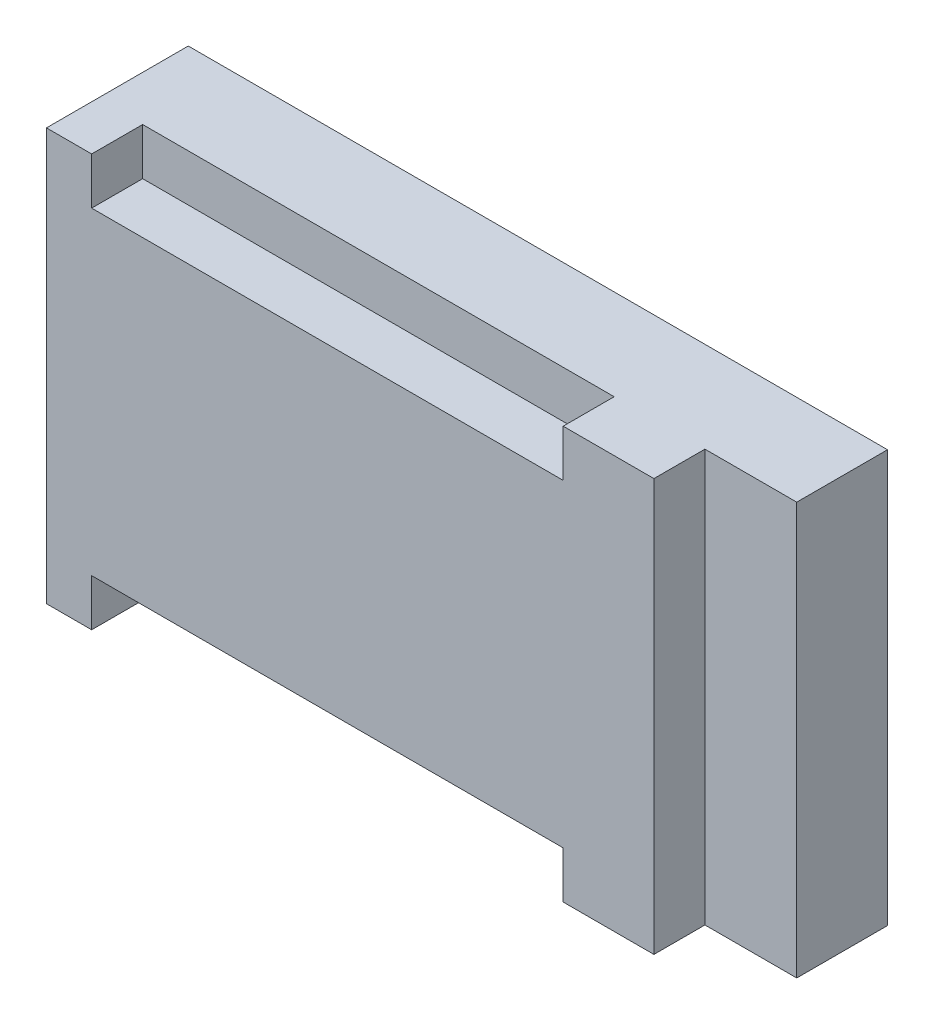
ISO-10303-21;
HEADER;
FILE_DESCRIPTION(('STEP AP214'),'2;1');
FILE_NAME('part.step','',(''),(''),'','','');
FILE_SCHEMA(('AUTOMOTIVE_DESIGN { 1 0 10303 214 1 1 1 1 }'));
ENDSEC;
DATA;
#1=APPLICATION_CONTEXT('core data for automotive mechanical design processes');
#2=APPLICATION_PROTOCOL_DEFINITION('international standard','automotive_design',2000,#1);
#3=PRODUCT_CONTEXT('',#1,'mechanical');
#4=PRODUCT('Part','Part','',(#3));
#5=PRODUCT_RELATED_PRODUCT_CATEGORY('part','',(#4));
#6=PRODUCT_DEFINITION_FORMATION('','',#4);
#7=PRODUCT_DEFINITION_CONTEXT('part definition',#1,'design');
#8=PRODUCT_DEFINITION('design','',#6,#7);
#9=PRODUCT_DEFINITION_SHAPE('','',#8);
#10=(LENGTH_UNIT() NAMED_UNIT(*) SI_UNIT(.MILLI.,.METRE.));
#11=(NAMED_UNIT(*) PLANE_ANGLE_UNIT() SI_UNIT($,.RADIAN.));
#12=(NAMED_UNIT(*) SI_UNIT($,.STERADIAN.) SOLID_ANGLE_UNIT());
#13=UNCERTAINTY_MEASURE_WITH_UNIT(LENGTH_MEASURE(1.E-05),#10,'distance_accuracy_value','');
#14=(GEOMETRIC_REPRESENTATION_CONTEXT(3) GLOBAL_UNCERTAINTY_ASSIGNED_CONTEXT((#13)) GLOBAL_UNIT_ASSIGNED_CONTEXT((#10,
#11,#12)) REPRESENTATION_CONTEXT('',''));
#15=CARTESIAN_POINT('',(0.,0.,0.));
#16=DIRECTION('',(0.,0.,1.));
#17=DIRECTION('',(1.,0.,0.));
#18=AXIS2_PLACEMENT_3D('',#15,#16,#17);
#19=CARTESIAN_POINT('',(-76.0303000874041,33.4271146936001,27.8));
#20=DIRECTION('',(1.,0.,0.));
#21=DIRECTION('',(0.,1.,0.));
#22=AXIS2_PLACEMENT_3D('',#19,#20,#21);
#23=PLANE('',#22);
#24=DIRECTION('',(0.,-1.,0.));
#25=VECTOR('',#24,1.);
#26=CARTESIAN_POINT('',(-76.0303000874041,33.4271146936001,0.));
#27=LINE('',#26,#25);
#28=CARTESIAN_POINT('',(-76.0303000874041,33.4271146936001,0.));
#29=VERTEX_POINT('',#28);
#30=CARTESIAN_POINT('',(-76.0303000874041,-47.3728853063999,0.));
#31=VERTEX_POINT('',#30);
#32=EDGE_CURVE('E210',#29,#31,#27,.T.);
#33=ORIENTED_EDGE('',*,*,#32,.T.);
#34=DIRECTION('',(0.,0.,-1.));
#35=VECTOR('',#34,1.);
#36=CARTESIAN_POINT('',(-76.0303000874041,-47.3728853063999,27.8));
#37=LINE('',#36,#35);
#38=CARTESIAN_POINT('',(-76.0303000874041,-47.3728853063999,27.8));
#39=VERTEX_POINT('',#38);
#40=EDGE_CURVE('E11',#39,#31,#37,.T.);
#41=ORIENTED_EDGE('',*,*,#40,.F.);
#42=DIRECTION('',(0.,-1.,0.));
#43=VECTOR('',#42,1.);
#44=CARTESIAN_POINT('',(-76.0303000874041,33.4271146936001,27.8));
#45=LINE('',#44,#43);
#46=CARTESIAN_POINT('',(-76.0303000874041,33.4271146936001,27.8));
#47=VERTEX_POINT('',#46);
#48=EDGE_CURVE('E217',#47,#39,#45,.T.);
#49=ORIENTED_EDGE('',*,*,#48,.F.);
#50=DIRECTION('',(0.,0.,-1.));
#51=VECTOR('',#50,1.);
#52=CARTESIAN_POINT('',(-76.0303000874041,33.4271146936001,27.8));
#53=LINE('',#52,#51);
#54=EDGE_CURVE('E237',#47,#29,#53,.T.);
#55=ORIENTED_EDGE('',*,*,#54,.T.);
#56=EDGE_LOOP('',(#33,#41,#49,#55));
#57=FACE_BOUND('',#56,.T.);
#58=ADVANCED_FACE('F32',(#57),#23,.F.);
#59=CARTESIAN_POINT('',(-76.0303000874041,-47.3728853063999,27.8));
#60=DIRECTION('',(0.,1.,0.));
#61=DIRECTION('',(0.,0.,1.));
#62=AXIS2_PLACEMENT_3D('',#59,#60,#61);
#63=PLANE('',#62);
#64=DIRECTION('',(1.,0.,0.));
#65=VECTOR('',#64,1.);
#66=CARTESIAN_POINT('',(61.0696999125959,-47.3728853063999,17.8));
#67=LINE('',#66,#65);
#68=CARTESIAN_POINT('',(43.0687127511308,-47.3728853063999,17.8));
#69=VERTEX_POINT('',#68);
#70=CARTESIAN_POINT('',(61.0696999125959,-47.3728853063999,17.8));
#71=VERTEX_POINT('',#70);
#72=EDGE_CURVE('E181',#69,#71,#67,.T.);
#73=ORIENTED_EDGE('',*,*,#72,.F.);
#74=DIRECTION('',(0.,0.,1.));
#75=VECTOR('',#74,1.);
#76=CARTESIAN_POINT('',(43.0687127511308,-47.3728853063999,17.8));
#77=LINE('',#76,#75);
#78=CARTESIAN_POINT('',(43.0687127511308,-47.3728853063999,27.8));
#79=VERTEX_POINT('',#78);
#80=EDGE_CURVE('E163',#69,#79,#77,.T.);
#81=ORIENTED_EDGE('',*,*,#80,.T.);
#82=DIRECTION('',(1.,0.,0.));
#83=VECTOR('',#82,1.);
#84=CARTESIAN_POINT('',(-76.0303000874041,-47.3728853063999,27.8));
#85=LINE('',#84,#83);
#86=CARTESIAN_POINT('',(25.2736208464924,-47.3728853063999,27.8));
#87=VERTEX_POINT('',#86);
#88=EDGE_CURVE('E220',#87,#79,#85,.T.);
#89=ORIENTED_EDGE('',*,*,#88,.F.);
#90=DIRECTION('',(0.,0.,1.));
#91=VECTOR('',#90,1.);
#92=CARTESIAN_POINT('',(25.2736208464924,-47.3728853063999,17.8));
#93=LINE('',#92,#91);
#94=CARTESIAN_POINT('',(25.2736208464924,-47.3728853063999,17.8));
#95=VERTEX_POINT('',#94);
#96=EDGE_CURVE('E213',#95,#87,#93,.T.);
#97=ORIENTED_EDGE('',*,*,#96,.F.);
#98=DIRECTION('',(1.,0.,0.));
#99=VECTOR('',#98,1.);
#100=CARTESIAN_POINT('',(-67.171445259524,-47.3728853063999,17.8));
#101=LINE('',#100,#99);
#102=CARTESIAN_POINT('',(-67.171445259524,-47.3728853063999,17.8));
#103=VERTEX_POINT('',#102);
#104=EDGE_CURVE('E191',#103,#95,#101,.T.);
#105=ORIENTED_EDGE('',*,*,#104,.F.);
#106=DIRECTION('',(0.,0.,1.));
#107=VECTOR('',#106,1.);
#108=CARTESIAN_POINT('',(-67.171445259524,-47.3728853063999,17.8));
#109=LINE('',#108,#107);
#110=CARTESIAN_POINT('',(-67.171445259524,-47.3728853063999,27.8));
#111=VERTEX_POINT('',#110);
#112=EDGE_CURVE('E201',#103,#111,#109,.T.);
#113=ORIENTED_EDGE('',*,*,#112,.T.);
#114=EDGE_CURVE('E222',#39,#111,#85,.T.);
#115=ORIENTED_EDGE('',*,*,#114,.F.);
#116=ORIENTED_EDGE('',*,*,#40,.T.);
#117=DIRECTION('',(1.,0.,0.));
#118=VECTOR('',#117,1.);
#119=CARTESIAN_POINT('',(-76.0303000874041,-47.3728853063999,0.));
#120=LINE('',#119,#118);
#121=CARTESIAN_POINT('',(61.0696999125959,-47.3728853063999,0.));
#122=VERTEX_POINT('',#121);
#123=EDGE_CURVE('E230',#31,#122,#120,.T.);
#124=ORIENTED_EDGE('',*,*,#123,.T.);
#125=DIRECTION('',(0.,0.,-1.));
#126=VECTOR('',#125,1.);
#127=CARTESIAN_POINT('',(61.0696999125959,-47.3728853063999,27.8));
#128=LINE('',#127,#126);
#129=EDGE_CURVE('E39',#71,#122,#128,.T.);
#130=ORIENTED_EDGE('',*,*,#129,.F.);
#131=EDGE_LOOP('',(#73,#81,#89,#97,#105,#113,#115,#116,#124,#130));
#132=FACE_BOUND('',#131,.T.);
#133=ADVANCED_FACE('F250',(#132),#63,.F.);
#134=CARTESIAN_POINT('',(61.0696999125959,33.4271146936001,27.8));
#135=DIRECTION('',(-1.,0.,0.));
#136=DIRECTION('',(0.,0.,1.));
#137=AXIS2_PLACEMENT_3D('',#134,#135,#136);
#138=PLANE('',#137);
#139=DIRECTION('',(0.,0.,-1.));
#140=VECTOR('',#139,1.);
#141=CARTESIAN_POINT('',(61.0696999125959,33.4271146936001,27.8));
#142=LINE('',#141,#140);
#143=CARTESIAN_POINT('',(61.0696999125959,33.4271146936001,17.8));
#144=VERTEX_POINT('',#143);
#145=CARTESIAN_POINT('',(61.0696999125959,33.4271146936001,0.));
#146=VERTEX_POINT('',#145);
#147=EDGE_CURVE('E240',#144,#146,#142,.T.);
#148=ORIENTED_EDGE('',*,*,#147,.F.);
#149=DIRECTION('',(0.,1.,0.));
#150=VECTOR('',#149,1.);
#151=CARTESIAN_POINT('',(61.0696999125959,33.4271146936001,17.8));
#152=LINE('',#151,#150);
#153=EDGE_CURVE('E172',#71,#144,#152,.T.);
#154=ORIENTED_EDGE('',*,*,#153,.F.);
#155=ORIENTED_EDGE('',*,*,#129,.T.);
#156=DIRECTION('',(0.,1.,0.));
#157=VECTOR('',#156,1.);
#158=CARTESIAN_POINT('',(61.0696999125959,33.4271146936001,0.));
#159=LINE('',#158,#157);
#160=EDGE_CURVE('E233',#122,#146,#159,.T.);
#161=ORIENTED_EDGE('',*,*,#160,.T.);
#162=EDGE_LOOP('',(#148,#154,#155,#161));
#163=FACE_BOUND('',#162,.T.);
#164=ADVANCED_FACE('F245',(#163),#138,.F.);
#165=CARTESIAN_POINT('',(-76.0303000874041,33.4271146936001,27.8));
#166=DIRECTION('',(0.,-1.,0.));
#167=DIRECTION('',(0.,0.,-1.));
#168=AXIS2_PLACEMENT_3D('',#165,#166,#167);
#169=PLANE('',#168);
#170=DIRECTION('',(-1.,0.,0.));
#171=VECTOR('',#170,1.);
#172=CARTESIAN_POINT('',(-76.0303000874041,33.4271146936001,27.8));
#173=LINE('',#172,#171);
#174=CARTESIAN_POINT('',(43.0687127511308,33.4271146936001,27.8));
#175=VERTEX_POINT('',#174);
#176=CARTESIAN_POINT('',(25.2736208464924,33.4271146936001,27.8));
#177=VERTEX_POINT('',#176);
#178=EDGE_CURVE('E227',#175,#177,#173,.T.);
#179=ORIENTED_EDGE('',*,*,#178,.F.);
#180=DIRECTION('',(0.,0.,1.));
#181=VECTOR('',#180,1.);
#182=CARTESIAN_POINT('',(43.0687127511308,33.4271146936001,17.8));
#183=LINE('',#182,#181);
#184=CARTESIAN_POINT('',(43.0687127511308,33.4271146936001,17.8));
#185=VERTEX_POINT('',#184);
#186=EDGE_CURVE('E54',#185,#175,#183,.T.);
#187=ORIENTED_EDGE('',*,*,#186,.F.);
#188=DIRECTION('',(-1.,0.,0.));
#189=VECTOR('',#188,1.);
#190=CARTESIAN_POINT('',(61.0696999125959,33.4271146936001,17.8));
#191=LINE('',#190,#189);
#192=EDGE_CURVE('E174',#144,#185,#191,.T.);
#193=ORIENTED_EDGE('',*,*,#192,.F.);
#194=ORIENTED_EDGE('',*,*,#147,.T.);
#195=DIRECTION('',(-1.,0.,0.));
#196=VECTOR('',#195,1.);
#197=CARTESIAN_POINT('',(-76.0303000874041,33.4271146936001,0.));
#198=LINE('',#197,#196);
#199=EDGE_CURVE('E221',#146,#29,#198,.T.);
#200=ORIENTED_EDGE('',*,*,#199,.T.);
#201=ORIENTED_EDGE('',*,*,#54,.F.);
#202=CARTESIAN_POINT('',(-67.171445259524,33.4271146936001,27.8));
#203=VERTEX_POINT('',#202);
#204=EDGE_CURVE('E225',#203,#47,#173,.T.);
#205=ORIENTED_EDGE('',*,*,#204,.F.);
#206=DIRECTION('',(0.,0.,1.));
#207=VECTOR('',#206,1.);
#208=CARTESIAN_POINT('',(-67.171445259524,33.4271146936001,17.8));
#209=LINE('',#208,#207);
#210=CARTESIAN_POINT('',(-67.171445259524,33.4271146936001,17.8));
#211=VERTEX_POINT('',#210);
#212=EDGE_CURVE('E165',#211,#203,#209,.T.);
#213=ORIENTED_EDGE('',*,*,#212,.F.);
#214=DIRECTION('',(-1.,0.,0.));
#215=VECTOR('',#214,1.);
#216=CARTESIAN_POINT('',(-67.171445259524,33.4271146936001,17.8));
#217=LINE('',#216,#215);
#218=CARTESIAN_POINT('',(25.2736208464924,33.4271146936001,17.8));
#219=VERTEX_POINT('',#218);
#220=EDGE_CURVE('E139',#219,#211,#217,.T.);
#221=ORIENTED_EDGE('',*,*,#220,.F.);
#222=DIRECTION('',(0.,0.,1.));
#223=VECTOR('',#222,1.);
#224=CARTESIAN_POINT('',(25.2736208464924,33.4271146936001,17.8));
#225=LINE('',#224,#223);
#226=EDGE_CURVE('E168',#219,#177,#225,.T.);
#227=ORIENTED_EDGE('',*,*,#226,.T.);
#228=EDGE_LOOP('',(#179,#187,#193,#194,#200,#201,#205,#213,#221,#227));
#229=FACE_BOUND('',#228,.T.);
#230=ADVANCED_FACE('F258',(#229),#169,.F.);
#231=CARTESIAN_POINT('',(0.,0.,27.8));
#232=DIRECTION('',(0.,0.,1.));
#233=DIRECTION('',(1.,0.,0.));
#234=AXIS2_PLACEMENT_3D('',#231,#232,#233);
#235=PLANE('',#234);
#236=DIRECTION('',(0.,-1.,0.));
#237=VECTOR('',#236,1.);
#238=CARTESIAN_POINT('',(43.0687127511308,33.4271146936001,27.8));
#239=LINE('',#238,#237);
#240=EDGE_CURVE('E175',#175,#79,#239,.T.);
#241=ORIENTED_EDGE('',*,*,#240,.F.);
#242=ORIENTED_EDGE('',*,*,#178,.T.);
#243=DIRECTION('',(0.,1.,0.));
#244=VECTOR('',#243,1.);
#245=CARTESIAN_POINT('',(25.2736208464924,33.4271146936001,27.8));
#246=LINE('',#245,#244);
#247=CARTESIAN_POINT('',(25.2736208464924,24.2271146936001,27.8));
#248=VERTEX_POINT('',#247);
#249=EDGE_CURVE('E152',#248,#177,#246,.T.);
#250=ORIENTED_EDGE('',*,*,#249,.F.);
#251=DIRECTION('',(1.,0.,0.));
#252=VECTOR('',#251,1.);
#253=CARTESIAN_POINT('',(-67.171445259524,24.2271146936001,27.8));
#254=LINE('',#253,#252);
#255=CARTESIAN_POINT('',(-67.171445259524,24.2271146936001,27.8));
#256=VERTEX_POINT('',#255);
#257=EDGE_CURVE('E154',#256,#248,#254,.T.);
#258=ORIENTED_EDGE('',*,*,#257,.F.);
#259=DIRECTION('',(0.,-1.,0.));
#260=VECTOR('',#259,1.);
#261=CARTESIAN_POINT('',(-67.171445259524,33.4271146936001,27.8));
#262=LINE('',#261,#260);
#263=EDGE_CURVE('E46',#203,#256,#262,.T.);
#264=ORIENTED_EDGE('',*,*,#263,.F.);
#265=ORIENTED_EDGE('',*,*,#204,.T.);
#266=ORIENTED_EDGE('',*,*,#48,.T.);
#267=ORIENTED_EDGE('',*,*,#114,.T.);
#268=DIRECTION('',(0.,-1.,0.));
#269=VECTOR('',#268,1.);
#270=CARTESIAN_POINT('',(-67.171445259524,-47.3728853063999,27.8));
#271=LINE('',#270,#269);
#272=CARTESIAN_POINT('',(-67.171445259524,-38.1728853063999,27.8));
#273=VERTEX_POINT('',#272);
#274=EDGE_CURVE('E167',#273,#111,#271,.T.);
#275=ORIENTED_EDGE('',*,*,#274,.F.);
#276=DIRECTION('',(-1.,0.,0.));
#277=VECTOR('',#276,1.);
#278=CARTESIAN_POINT('',(-67.171445259524,-38.1728853063999,27.8));
#279=LINE('',#278,#277);
#280=CARTESIAN_POINT('',(25.2736208464924,-38.1728853063999,27.8));
#281=VERTEX_POINT('',#280);
#282=EDGE_CURVE('E192',#281,#273,#279,.T.);
#283=ORIENTED_EDGE('',*,*,#282,.F.);
#284=DIRECTION('',(0.,1.,0.));
#285=VECTOR('',#284,1.);
#286=CARTESIAN_POINT('',(25.2736208464924,-47.3728853063999,27.8));
#287=LINE('',#286,#285);
#288=EDGE_CURVE('E203',#87,#281,#287,.T.);
#289=ORIENTED_EDGE('',*,*,#288,.F.);
#290=ORIENTED_EDGE('',*,*,#88,.T.);
#291=EDGE_LOOP('',(#241,#242,#250,#258,#264,#265,#266,#267,#275,#283,#289,#290));
#292=FACE_BOUND('',#291,.T.);
#293=ADVANCED_FACE('F264',(#292),#235,.T.);
#294=CARTESIAN_POINT('',(0.,0.,0.));
#295=DIRECTION('',(0.,0.,1.));
#296=DIRECTION('',(1.,0.,0.));
#297=AXIS2_PLACEMENT_3D('',#294,#295,#296);
#298=PLANE('',#297);
#299=CARTESIAN_POINT('',(35.8196999125959,14.0271146936001,0.));
#300=DIRECTION('',(0.,0.,-1.));
#301=DIRECTION('',(-1.,0.,0.));
#302=AXIS2_PLACEMENT_3D('',#299,#300,#301);
#303=CIRCLE('',#302,1.25);
#304=CARTESIAN_POINT('',(34.5696999125959,14.0271146936001,0.));
#305=VERTEX_POINT('',#304);
#306=EDGE_CURVE('E382',#305,#305,#303,.T.);
#307=ORIENTED_EDGE('',*,*,#306,.F.);
#308=EDGE_LOOP('',(#307));
#309=FACE_BOUND('',#308,.T.);
#310=CARTESIAN_POINT('',(35.8196999125959,-26.7228853063999,0.));
#311=DIRECTION('',(0.,0.,-1.));
#312=DIRECTION('',(-1.,0.,0.));
#313=AXIS2_PLACEMENT_3D('',#310,#311,#312);
#314=CIRCLE('',#313,1.25);
#315=CARTESIAN_POINT('',(34.5696999125959,-26.7228853063999,0.));
#316=VERTEX_POINT('',#315);
#317=EDGE_CURVE('E376',#316,#316,#314,.T.);
#318=ORIENTED_EDGE('',*,*,#317,.F.);
#319=EDGE_LOOP('',(#318));
#320=FACE_BOUND('',#319,.T.);
#321=CARTESIAN_POINT('',(-65.5803000874041,-26.7228853063999,0.));
#322=DIRECTION('',(0.,0.,-1.));
#323=DIRECTION('',(-1.,0.,0.));
#324=AXIS2_PLACEMENT_3D('',#321,#322,#323);
#325=CIRCLE('',#324,1.25);
#326=CARTESIAN_POINT('',(-66.8303000874041,-26.7228853063999,0.));
#327=VERTEX_POINT('',#326);
#328=EDGE_CURVE('E367',#327,#327,#325,.T.);
#329=ORIENTED_EDGE('',*,*,#328,.F.);
#330=EDGE_LOOP('',(#329));
#331=FACE_BOUND('',#330,.T.);
#332=CARTESIAN_POINT('',(-65.5803000874041,12.7771146936001,0.));
#333=DIRECTION('',(0.,0.,-1.));
#334=DIRECTION('',(-1.,0.,0.));
#335=AXIS2_PLACEMENT_3D('',#332,#333,#334);
#336=CIRCLE('',#335,1.25);
#337=CARTESIAN_POINT('',(-66.8303000874041,12.7771146936001,0.));
#338=VERTEX_POINT('',#337);
#339=EDGE_CURVE('E157',#338,#338,#336,.T.);
#340=ORIENTED_EDGE('',*,*,#339,.F.);
#341=EDGE_LOOP('',(#340));
#342=FACE_BOUND('',#341,.T.);
#343=ORIENTED_EDGE('',*,*,#32,.F.);
#344=ORIENTED_EDGE('',*,*,#199,.F.);
#345=ORIENTED_EDGE('',*,*,#160,.F.);
#346=ORIENTED_EDGE('',*,*,#123,.F.);
#347=EDGE_LOOP('',(#343,#344,#345,#346));
#348=FACE_BOUND('',#347,.T.);
#349=ADVANCED_FACE('F254',(#309,#320,#331,#342,#348),#298,.F.);
#350=CARTESIAN_POINT('',(-67.171445259524,-47.3728853063999,17.8));
#351=DIRECTION('',(-1.,0.,0.));
#352=DIRECTION('',(0.,0.,1.));
#353=AXIS2_PLACEMENT_3D('',#350,#351,#352);
#354=PLANE('',#353);
#355=ORIENTED_EDGE('',*,*,#274,.T.);
#356=ORIENTED_EDGE('',*,*,#112,.F.);
#357=DIRECTION('',(0.,-1.,0.));
#358=VECTOR('',#357,1.);
#359=CARTESIAN_POINT('',(-67.171445259524,-47.3728853063999,17.8));
#360=LINE('',#359,#358);
#361=CARTESIAN_POINT('',(-67.171445259524,-38.1728853063999,17.8));
#362=VERTEX_POINT('',#361);
#363=EDGE_CURVE('E188',#362,#103,#360,.T.);
#364=ORIENTED_EDGE('',*,*,#363,.F.);
#365=DIRECTION('',(0.,0.,1.));
#366=VECTOR('',#365,1.);
#367=CARTESIAN_POINT('',(-67.171445259524,-38.1728853063999,17.8));
#368=LINE('',#367,#366);
#369=EDGE_CURVE('E208',#362,#273,#368,.T.);
#370=ORIENTED_EDGE('',*,*,#369,.T.);
#371=EDGE_LOOP('',(#355,#356,#364,#370));
#372=FACE_BOUND('',#371,.T.);
#373=ADVANCED_FACE('F301',(#372),#354,.F.);
#374=CARTESIAN_POINT('',(-67.171445259524,-38.1728853063999,17.8));
#375=DIRECTION('',(0.,1.,0.));
#376=DIRECTION('',(0.,0.,1.));
#377=AXIS2_PLACEMENT_3D('',#374,#375,#376);
#378=PLANE('',#377);
#379=ORIENTED_EDGE('',*,*,#282,.T.);
#380=ORIENTED_EDGE('',*,*,#369,.F.);
#381=DIRECTION('',(-1.,0.,0.));
#382=VECTOR('',#381,1.);
#383=CARTESIAN_POINT('',(-67.171445259524,-38.1728853063999,17.8));
#384=LINE('',#383,#382);
#385=CARTESIAN_POINT('',(25.2736208464924,-38.1728853063999,17.8));
#386=VERTEX_POINT('',#385);
#387=EDGE_CURVE('E198',#386,#362,#384,.T.);
#388=ORIENTED_EDGE('',*,*,#387,.F.);
#389=DIRECTION('',(0.,0.,1.));
#390=VECTOR('',#389,1.);
#391=CARTESIAN_POINT('',(25.2736208464924,-38.1728853063999,17.8));
#392=LINE('',#391,#390);
#393=EDGE_CURVE('E211',#386,#281,#392,.T.);
#394=ORIENTED_EDGE('',*,*,#393,.T.);
#395=EDGE_LOOP('',(#379,#380,#388,#394));
#396=FACE_BOUND('',#395,.T.);
#397=ADVANCED_FACE('F307',(#396),#378,.F.);
#398=CARTESIAN_POINT('',(25.2736208464924,-47.3728853063999,17.8));
#399=DIRECTION('',(1.,0.,0.));
#400=DIRECTION('',(0.,0.,-1.));
#401=AXIS2_PLACEMENT_3D('',#398,#399,#400);
#402=PLANE('',#401);
#403=ORIENTED_EDGE('',*,*,#288,.T.);
#404=ORIENTED_EDGE('',*,*,#393,.F.);
#405=DIRECTION('',(0.,1.,0.));
#406=VECTOR('',#405,1.);
#407=CARTESIAN_POINT('',(25.2736208464924,-47.3728853063999,17.8));
#408=LINE('',#407,#406);
#409=EDGE_CURVE('E195',#95,#386,#408,.T.);
#410=ORIENTED_EDGE('',*,*,#409,.F.);
#411=ORIENTED_EDGE('',*,*,#96,.T.);
#412=EDGE_LOOP('',(#403,#404,#410,#411));
#413=FACE_BOUND('',#412,.T.);
#414=ADVANCED_FACE('F309',(#413),#402,.F.);
#415=CARTESIAN_POINT('',(0.,0.,17.8));
#416=DIRECTION('',(0.,0.,-1.));
#417=DIRECTION('',(-1.,0.,0.));
#418=AXIS2_PLACEMENT_3D('',#415,#416,#417);
#419=PLANE('',#418);
#420=ORIENTED_EDGE('',*,*,#363,.T.);
#421=ORIENTED_EDGE('',*,*,#104,.T.);
#422=ORIENTED_EDGE('',*,*,#409,.T.);
#423=ORIENTED_EDGE('',*,*,#387,.T.);
#424=EDGE_LOOP('',(#420,#421,#422,#423));
#425=FACE_BOUND('',#424,.T.);
#426=ADVANCED_FACE('F312',(#425),#419,.F.);
#427=CARTESIAN_POINT('',(-67.171445259524,33.4271146936001,17.8));
#428=DIRECTION('',(-1.,0.,0.));
#429=DIRECTION('',(0.,0.,1.));
#430=AXIS2_PLACEMENT_3D('',#427,#428,#429);
#431=PLANE('',#430);
#432=ORIENTED_EDGE('',*,*,#263,.T.);
#433=DIRECTION('',(0.,0.,1.));
#434=VECTOR('',#433,1.);
#435=CARTESIAN_POINT('',(-67.171445259524,24.2271146936001,17.8));
#436=LINE('',#435,#434);
#437=CARTESIAN_POINT('',(-67.171445259524,24.2271146936001,17.8));
#438=VERTEX_POINT('',#437);
#439=EDGE_CURVE('E129',#438,#256,#436,.T.);
#440=ORIENTED_EDGE('',*,*,#439,.F.);
#441=DIRECTION('',(0.,-1.,0.));
#442=VECTOR('',#441,1.);
#443=CARTESIAN_POINT('',(-67.171445259524,33.4271146936001,17.8));
#444=LINE('',#443,#442);
#445=EDGE_CURVE('E133',#211,#438,#444,.T.);
#446=ORIENTED_EDGE('',*,*,#445,.F.);
#447=ORIENTED_EDGE('',*,*,#212,.T.);
#448=EDGE_LOOP('',(#432,#440,#446,#447));
#449=FACE_BOUND('',#448,.T.);
#450=ADVANCED_FACE('F131',(#449),#431,.F.);
#451=CARTESIAN_POINT('',(25.2736208464924,33.4271146936001,17.8));
#452=DIRECTION('',(1.,0.,0.));
#453=DIRECTION('',(0.,0.,-1.));
#454=AXIS2_PLACEMENT_3D('',#451,#452,#453);
#455=PLANE('',#454);
#456=ORIENTED_EDGE('',*,*,#249,.T.);
#457=ORIENTED_EDGE('',*,*,#226,.F.);
#458=DIRECTION('',(0.,1.,0.));
#459=VECTOR('',#458,1.);
#460=CARTESIAN_POINT('',(25.2736208464924,33.4271146936001,17.8));
#461=LINE('',#460,#459);
#462=CARTESIAN_POINT('',(25.2736208464924,24.2271146936001,17.8));
#463=VERTEX_POINT('',#462);
#464=EDGE_CURVE('E147',#463,#219,#461,.T.);
#465=ORIENTED_EDGE('',*,*,#464,.F.);
#466=DIRECTION('',(0.,0.,1.));
#467=VECTOR('',#466,1.);
#468=CARTESIAN_POINT('',(25.2736208464924,24.2271146936001,17.8));
#469=LINE('',#468,#467);
#470=EDGE_CURVE('E138',#463,#248,#469,.T.);
#471=ORIENTED_EDGE('',*,*,#470,.T.);
#472=EDGE_LOOP('',(#456,#457,#465,#471));
#473=FACE_BOUND('',#472,.T.);
#474=ADVANCED_FACE('F322',(#473),#455,.F.);
#475=CARTESIAN_POINT('',(-67.171445259524,24.2271146936001,17.8));
#476=DIRECTION('',(0.,-1.,0.));
#477=DIRECTION('',(0.,0.,-1.));
#478=AXIS2_PLACEMENT_3D('',#475,#476,#477);
#479=PLANE('',#478);
#480=ORIENTED_EDGE('',*,*,#257,.T.);
#481=ORIENTED_EDGE('',*,*,#470,.F.);
#482=DIRECTION('',(1.,0.,0.));
#483=VECTOR('',#482,1.);
#484=CARTESIAN_POINT('',(-67.171445259524,24.2271146936001,17.8));
#485=LINE('',#484,#483);
#486=EDGE_CURVE('E142',#438,#463,#485,.T.);
#487=ORIENTED_EDGE('',*,*,#486,.F.);
#488=ORIENTED_EDGE('',*,*,#439,.T.);
#489=EDGE_LOOP('',(#480,#481,#487,#488));
#490=FACE_BOUND('',#489,.T.);
#491=ADVANCED_FACE('F143',(#490),#479,.F.);
#492=CARTESIAN_POINT('',(0.,0.,17.8));
#493=DIRECTION('',(0.,0.,1.));
#494=DIRECTION('',(1.,0.,0.));
#495=AXIS2_PLACEMENT_3D('',#492,#493,#494);
#496=PLANE('',#495);
#497=ORIENTED_EDGE('',*,*,#445,.T.);
#498=ORIENTED_EDGE('',*,*,#486,.T.);
#499=ORIENTED_EDGE('',*,*,#464,.T.);
#500=ORIENTED_EDGE('',*,*,#220,.T.);
#501=EDGE_LOOP('',(#497,#498,#499,#500));
#502=FACE_BOUND('',#501,.T.);
#503=ADVANCED_FACE('F149',(#502),#496,.T.);
#504=CARTESIAN_POINT('',(43.0687127511308,33.4271146936001,17.8));
#505=DIRECTION('',(-1.,0.,0.));
#506=DIRECTION('',(0.,0.,1.));
#507=AXIS2_PLACEMENT_3D('',#504,#505,#506);
#508=PLANE('',#507);
#509=ORIENTED_EDGE('',*,*,#240,.T.);
#510=ORIENTED_EDGE('',*,*,#80,.F.);
#511=DIRECTION('',(0.,-1.,0.));
#512=VECTOR('',#511,1.);
#513=CARTESIAN_POINT('',(43.0687127511308,33.4271146936001,17.8));
#514=LINE('',#513,#512);
#515=EDGE_CURVE('E178',#185,#69,#514,.T.);
#516=ORIENTED_EDGE('',*,*,#515,.F.);
#517=ORIENTED_EDGE('',*,*,#186,.T.);
#518=EDGE_LOOP('',(#509,#510,#516,#517));
#519=FACE_BOUND('',#518,.T.);
#520=ADVANCED_FACE('F272',(#519),#508,.F.);
#521=CARTESIAN_POINT('',(0.,0.,17.8));
#522=DIRECTION('',(0.,0.,-1.));
#523=DIRECTION('',(-1.,0.,0.));
#524=AXIS2_PLACEMENT_3D('',#521,#522,#523);
#525=PLANE('',#524);
#526=ORIENTED_EDGE('',*,*,#153,.T.);
#527=ORIENTED_EDGE('',*,*,#192,.T.);
#528=ORIENTED_EDGE('',*,*,#515,.T.);
#529=ORIENTED_EDGE('',*,*,#72,.T.);
#530=EDGE_LOOP('',(#526,#527,#528,#529));
#531=FACE_BOUND('',#530,.T.);
#532=ADVANCED_FACE('F275',(#531),#525,.F.);
#533=CARTESIAN_POINT('',(-65.5803000874041,12.7771146936001,5.));
#534=DIRECTION('',(0.,0.,-1.));
#535=DIRECTION('',(-1.,0.,0.));
#536=AXIS2_PLACEMENT_3D('',#533,#534,#535);
#537=CYLINDRICAL_SURFACE('',#536,1.25);
#538=CARTESIAN_POINT('',(-65.5803000874041,12.7771146936001,5.));
#539=DIRECTION('',(0.,0.,-1.));
#540=DIRECTION('',(-1.,0.,0.));
#541=AXIS2_PLACEMENT_3D('',#538,#539,#540);
#542=CIRCLE('',#541,1.25);
#543=CARTESIAN_POINT('',(-66.8303000874041,12.7771146936001,5.));
#544=VERTEX_POINT('',#543);
#545=EDGE_CURVE('E184',#544,#544,#542,.T.);
#546=ORIENTED_EDGE('',*,*,#545,.F.);
#547=EDGE_LOOP('',(#546));
#548=FACE_BOUND('',#547,.T.);
#549=ORIENTED_EDGE('',*,*,#339,.T.);
#550=EDGE_LOOP('',(#549));
#551=FACE_BOUND('',#550,.T.);
#552=ADVANCED_FACE('F277',(#548,#551),#537,.F.);
#553=CARTESIAN_POINT('',(-65.5803000874041,12.7771146936001,5.));
#554=DIRECTION('',(0.,0.,-1.));
#555=DIRECTION('',(-1.,0.,0.));
#556=AXIS2_PLACEMENT_3D('',#553,#554,#555);
#557=PLANE('',#556);
#558=ORIENTED_EDGE('',*,*,#545,.T.);
#559=EDGE_LOOP('',(#558));
#560=FACE_BOUND('',#559,.T.);
#561=ADVANCED_FACE('F283',(#560),#557,.T.);
#562=CARTESIAN_POINT('',(-65.5803000874041,-26.7228853063999,5.));
#563=DIRECTION('',(0.,0.,-1.));
#564=DIRECTION('',(-1.,0.,0.));
#565=AXIS2_PLACEMENT_3D('',#562,#563,#564);
#566=CYLINDRICAL_SURFACE('',#565,1.25);
#567=CARTESIAN_POINT('',(-65.5803000874041,-26.7228853063999,5.));
#568=DIRECTION('',(0.,0.,-1.));
#569=DIRECTION('',(-1.,0.,0.));
#570=AXIS2_PLACEMENT_3D('',#567,#568,#569);
#571=CIRCLE('',#570,1.25);
#572=CARTESIAN_POINT('',(-66.8303000874041,-26.7228853063999,5.));
#573=VERTEX_POINT('',#572);
#574=EDGE_CURVE('E366',#573,#573,#571,.T.);
#575=ORIENTED_EDGE('',*,*,#574,.F.);
#576=EDGE_LOOP('',(#575));
#577=FACE_BOUND('',#576,.T.);
#578=ORIENTED_EDGE('',*,*,#328,.T.);
#579=EDGE_LOOP('',(#578));
#580=FACE_BOUND('',#579,.T.);
#581=ADVANCED_FACE('F338',(#577,#580),#566,.F.);
#582=CARTESIAN_POINT('',(-65.5803000874041,-26.7228853063999,5.));
#583=DIRECTION('',(0.,0.,-1.));
#584=DIRECTION('',(-1.,0.,0.));
#585=AXIS2_PLACEMENT_3D('',#582,#583,#584);
#586=PLANE('',#585);
#587=ORIENTED_EDGE('',*,*,#574,.T.);
#588=EDGE_LOOP('',(#587));
#589=FACE_BOUND('',#588,.T.);
#590=ADVANCED_FACE('F352',(#589),#586,.T.);
#591=CARTESIAN_POINT('',(35.8196999125959,-26.7228853063999,5.));
#592=DIRECTION('',(0.,0.,-1.));
#593=DIRECTION('',(-1.,0.,0.));
#594=AXIS2_PLACEMENT_3D('',#591,#592,#593);
#595=CYLINDRICAL_SURFACE('',#594,1.25);
#596=CARTESIAN_POINT('',(35.8196999125959,-26.7228853063999,5.));
#597=DIRECTION('',(0.,0.,-1.));
#598=DIRECTION('',(-1.,0.,0.));
#599=AXIS2_PLACEMENT_3D('',#596,#597,#598);
#600=CIRCLE('',#599,1.25);
#601=CARTESIAN_POINT('',(34.5696999125959,-26.7228853063999,5.));
#602=VERTEX_POINT('',#601);
#603=EDGE_CURVE('E371',#602,#602,#600,.T.);
#604=ORIENTED_EDGE('',*,*,#603,.F.);
#605=EDGE_LOOP('',(#604));
#606=FACE_BOUND('',#605,.T.);
#607=ORIENTED_EDGE('',*,*,#317,.T.);
#608=EDGE_LOOP('',(#607));
#609=FACE_BOUND('',#608,.T.);
#610=ADVANCED_FACE('F349',(#606,#609),#595,.F.);
#611=CARTESIAN_POINT('',(35.8196999125959,-26.7228853063999,5.));
#612=DIRECTION('',(0.,0.,-1.));
#613=DIRECTION('',(-1.,0.,0.));
#614=AXIS2_PLACEMENT_3D('',#611,#612,#613);
#615=PLANE('',#614);
#616=ORIENTED_EDGE('',*,*,#603,.T.);
#617=EDGE_LOOP('',(#616));
#618=FACE_BOUND('',#617,.T.);
#619=ADVANCED_FACE('F344',(#618),#615,.T.);
#620=CARTESIAN_POINT('',(35.8196999125959,14.0271146936001,5.));
#621=DIRECTION('',(0.,0.,-1.));
#622=DIRECTION('',(-1.,0.,0.));
#623=AXIS2_PLACEMENT_3D('',#620,#621,#622);
#624=CYLINDRICAL_SURFACE('',#623,1.25);
#625=CARTESIAN_POINT('',(35.8196999125959,14.0271146936001,5.));
#626=DIRECTION('',(0.,0.,-1.));
#627=DIRECTION('',(-1.,0.,0.));
#628=AXIS2_PLACEMENT_3D('',#625,#626,#627);
#629=CIRCLE('',#628,1.25);
#630=CARTESIAN_POINT('',(34.5696999125959,14.0271146936001,5.));
#631=VERTEX_POINT('',#630);
#632=EDGE_CURVE('E379',#631,#631,#629,.T.);
#633=ORIENTED_EDGE('',*,*,#632,.F.);
#634=EDGE_LOOP('',(#633));
#635=FACE_BOUND('',#634,.T.);
#636=ORIENTED_EDGE('',*,*,#306,.T.);
#637=EDGE_LOOP('',(#636));
#638=FACE_BOUND('',#637,.T.);
#639=ADVANCED_FACE('F340',(#635,#638),#624,.F.);
#640=CARTESIAN_POINT('',(35.8196999125959,14.0271146936001,5.));
#641=DIRECTION('',(0.,0.,-1.));
#642=DIRECTION('',(-1.,0.,0.));
#643=AXIS2_PLACEMENT_3D('',#640,#641,#642);
#644=PLANE('',#643);
#645=ORIENTED_EDGE('',*,*,#632,.T.);
#646=EDGE_LOOP('',(#645));
#647=FACE_BOUND('',#646,.T.);
#648=ADVANCED_FACE('F343',(#647),#644,.T.);
#649=CLOSED_SHELL('',(#58,#133,#164,#230,#293,#349,#373,#397,#414,#426,#450,#474,#491,#503,#520,
#532,#552,#561,#581,#590,#610,#619,#639,#648));
#650=MANIFOLD_SOLID_BREP('B2',#649);
#651=ADVANCED_BREP_SHAPE_REPRESENTATION('',(#18,#650),#14);
#652=SHAPE_DEFINITION_REPRESENTATION(#9,#651);
ENDSEC;
END-ISO-10303-21;
